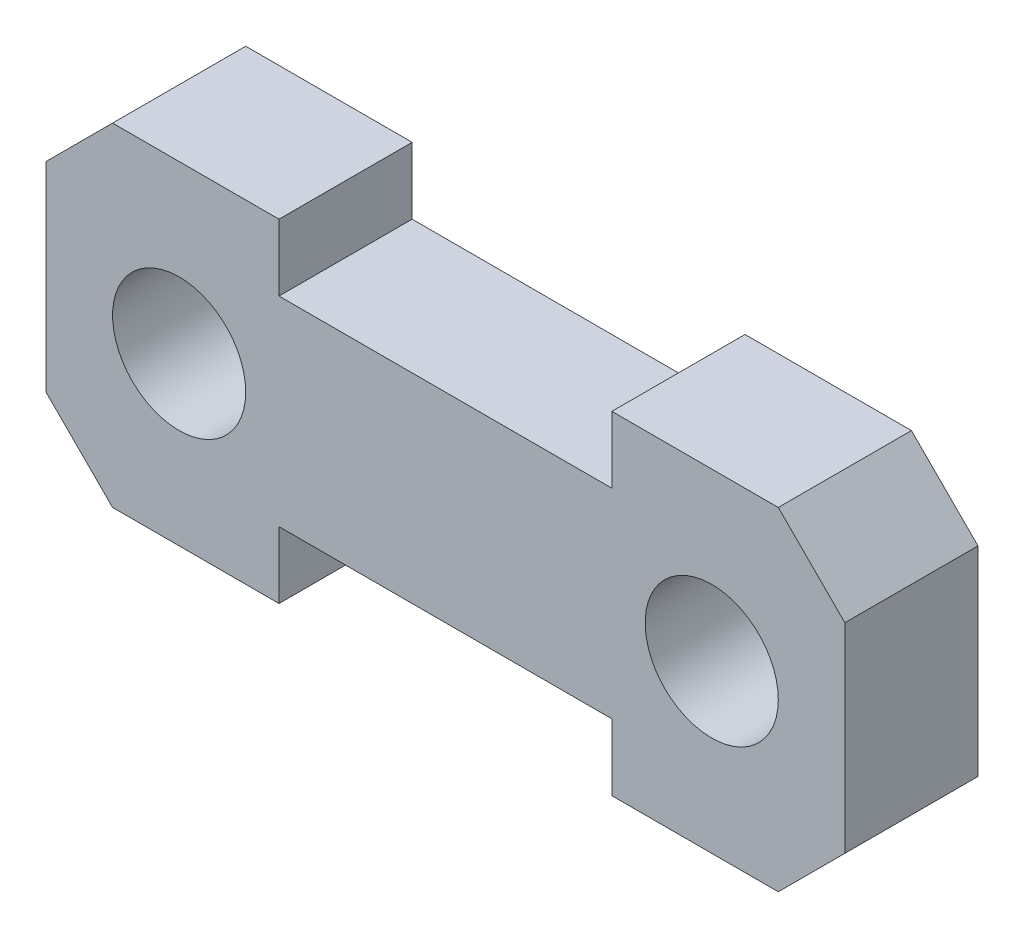
ISO-10303-21;
HEADER;
FILE_DESCRIPTION(('STEP AP214'),'2;1');
FILE_NAME('part.step','',(''),(''),'','','');
FILE_SCHEMA(('AUTOMOTIVE_DESIGN { 1 0 10303 214 1 1 1 1 }'));
ENDSEC;
DATA;
#1=APPLICATION_CONTEXT('core data for automotive mechanical design processes');
#2=APPLICATION_PROTOCOL_DEFINITION('international standard','automotive_design',2000,#1);
#3=PRODUCT_CONTEXT('',#1,'mechanical');
#4=PRODUCT('Part','Part','',(#3));
#5=PRODUCT_RELATED_PRODUCT_CATEGORY('part','',(#4));
#6=PRODUCT_DEFINITION_FORMATION('','',#4);
#7=PRODUCT_DEFINITION_CONTEXT('part definition',#1,'design');
#8=PRODUCT_DEFINITION('design','',#6,#7);
#9=PRODUCT_DEFINITION_SHAPE('','',#8);
#10=(LENGTH_UNIT() NAMED_UNIT(*) SI_UNIT(.MILLI.,.METRE.));
#11=(NAMED_UNIT(*) PLANE_ANGLE_UNIT() SI_UNIT($,.RADIAN.));
#12=(NAMED_UNIT(*) SI_UNIT($,.STERADIAN.) SOLID_ANGLE_UNIT());
#13=UNCERTAINTY_MEASURE_WITH_UNIT(LENGTH_MEASURE(1.E-05),#10,'distance_accuracy_value','');
#14=(GEOMETRIC_REPRESENTATION_CONTEXT(3) GLOBAL_UNCERTAINTY_ASSIGNED_CONTEXT((#13)) GLOBAL_UNIT_ASSIGNED_CONTEXT((#10,
#11,#12)) REPRESENTATION_CONTEXT('',''));
#15=CARTESIAN_POINT('',(0.,0.,0.));
#16=DIRECTION('',(0.,0.,1.));
#17=DIRECTION('',(1.,0.,0.));
#18=AXIS2_PLACEMENT_3D('',#15,#16,#17);
#19=CARTESIAN_POINT('',(0.,0.,2.));
#20=DIRECTION('',(0.,0.,-1.));
#21=DIRECTION('',(-1.,0.,0.));
#22=AXIS2_PLACEMENT_3D('',#19,#20,#21);
#23=PLANE('',#22);
#24=DIRECTION('',(-1.,0.,0.));
#25=VECTOR('',#24,1.);
#26=CARTESIAN_POINT('',(-5.,2.5,2.));
#27=LINE('',#26,#25);
#28=CARTESIAN_POINT('',(-2.5,2.5,2.));
#29=VERTEX_POINT('',#28);
#30=CARTESIAN_POINT('',(-5.,2.5,2.));
#31=VERTEX_POINT('',#30);
#32=EDGE_CURVE('E211',#29,#31,#27,.T.);
#33=ORIENTED_EDGE('',*,*,#32,.T.);
#34=DIRECTION('',(-0.707106781186548,-0.707106781186548,0.));
#35=VECTOR('',#34,1.);
#36=CARTESIAN_POINT('',(-6.,1.5,2.));
#37=LINE('',#36,#35);
#38=CARTESIAN_POINT('',(-6.,1.5,2.));
#39=VERTEX_POINT('',#38);
#40=EDGE_CURVE('E119',#31,#39,#37,.T.);
#41=ORIENTED_EDGE('',*,*,#40,.T.);
#42=DIRECTION('',(0.,-1.,0.));
#43=VECTOR('',#42,1.);
#44=CARTESIAN_POINT('',(-6.,1.5,2.));
#45=LINE('',#44,#43);
#46=CARTESIAN_POINT('',(-6.,-1.5,2.));
#47=VERTEX_POINT('',#46);
#48=EDGE_CURVE('E250',#39,#47,#45,.T.);
#49=ORIENTED_EDGE('',*,*,#48,.T.);
#50=DIRECTION('',(0.707106781186548,-0.707106781186547,0.));
#51=VECTOR('',#50,1.);
#52=CARTESIAN_POINT('',(-6.,-1.5,2.));
#53=LINE('',#52,#51);
#54=CARTESIAN_POINT('',(-5.,-2.5,2.));
#55=VERTEX_POINT('',#54);
#56=EDGE_CURVE('E269',#47,#55,#53,.T.);
#57=ORIENTED_EDGE('',*,*,#56,.T.);
#58=DIRECTION('',(1.,0.,0.));
#59=VECTOR('',#58,1.);
#60=CARTESIAN_POINT('',(-5.,-2.5,2.));
#61=LINE('',#60,#59);
#62=CARTESIAN_POINT('',(-2.5,-2.5,2.));
#63=VERTEX_POINT('',#62);
#64=EDGE_CURVE('E266',#55,#63,#61,.T.);
#65=ORIENTED_EDGE('',*,*,#64,.T.);
#66=DIRECTION('',(0.,1.,0.));
#67=VECTOR('',#66,1.);
#68=CARTESIAN_POINT('',(-2.5,-2.5,2.));
#69=LINE('',#68,#67);
#70=CARTESIAN_POINT('',(-2.5,-1.5,2.));
#71=VERTEX_POINT('',#70);
#72=EDGE_CURVE('E268',#63,#71,#69,.T.);
#73=ORIENTED_EDGE('',*,*,#72,.T.);
#74=DIRECTION('',(1.,0.,0.));
#75=VECTOR('',#74,1.);
#76=CARTESIAN_POINT('',(-2.5,-1.5,2.));
#77=LINE('',#76,#75);
#78=CARTESIAN_POINT('',(2.5,-1.5,2.));
#79=VERTEX_POINT('',#78);
#80=EDGE_CURVE('E271',#71,#79,#77,.T.);
#81=ORIENTED_EDGE('',*,*,#80,.T.);
#82=DIRECTION('',(0.,-1.,0.));
#83=VECTOR('',#82,1.);
#84=CARTESIAN_POINT('',(2.5,-2.5,2.));
#85=LINE('',#84,#83);
#86=CARTESIAN_POINT('',(2.5,-2.5,2.));
#87=VERTEX_POINT('',#86);
#88=EDGE_CURVE('E277',#79,#87,#85,.T.);
#89=ORIENTED_EDGE('',*,*,#88,.T.);
#90=DIRECTION('',(1.,0.,0.));
#91=VECTOR('',#90,1.);
#92=CARTESIAN_POINT('',(2.5,-2.5,2.));
#93=LINE('',#92,#91);
#94=CARTESIAN_POINT('',(5.,-2.5,2.));
#95=VERTEX_POINT('',#94);
#96=EDGE_CURVE('E279',#87,#95,#93,.T.);
#97=ORIENTED_EDGE('',*,*,#96,.T.);
#98=DIRECTION('',(0.707106781186548,0.707106781186547,0.));
#99=VECTOR('',#98,1.);
#100=CARTESIAN_POINT('',(5.,-2.5,2.));
#101=LINE('',#100,#99);
#102=CARTESIAN_POINT('',(6.,-1.5,2.));
#103=VERTEX_POINT('',#102);
#104=EDGE_CURVE('E281',#95,#103,#101,.T.);
#105=ORIENTED_EDGE('',*,*,#104,.T.);
#106=DIRECTION('',(0.,1.,0.));
#107=VECTOR('',#106,1.);
#108=CARTESIAN_POINT('',(6.,1.5,2.));
#109=LINE('',#108,#107);
#110=CARTESIAN_POINT('',(6.,1.5,2.));
#111=VERTEX_POINT('',#110);
#112=EDGE_CURVE('E283',#103,#111,#109,.T.);
#113=ORIENTED_EDGE('',*,*,#112,.T.);
#114=DIRECTION('',(-0.707106781186548,0.707106781186548,0.));
#115=VECTOR('',#114,1.);
#116=CARTESIAN_POINT('',(5.,2.5,2.));
#117=LINE('',#116,#115);
#118=CARTESIAN_POINT('',(5.,2.5,2.));
#119=VERTEX_POINT('',#118);
#120=EDGE_CURVE('E285',#111,#119,#117,.T.);
#121=ORIENTED_EDGE('',*,*,#120,.T.);
#122=DIRECTION('',(-1.,0.,0.));
#123=VECTOR('',#122,1.);
#124=CARTESIAN_POINT('',(2.5,2.5,2.));
#125=LINE('',#124,#123);
#126=CARTESIAN_POINT('',(2.5,2.5,2.));
#127=VERTEX_POINT('',#126);
#128=EDGE_CURVE('E162',#119,#127,#125,.T.);
#129=ORIENTED_EDGE('',*,*,#128,.T.);
#130=DIRECTION('',(0.,-1.,0.));
#131=VECTOR('',#130,1.);
#132=CARTESIAN_POINT('',(2.5,2.5,2.));
#133=LINE('',#132,#131);
#134=CARTESIAN_POINT('',(2.5,1.5,2.));
#135=VERTEX_POINT('',#134);
#136=EDGE_CURVE('E156',#127,#135,#133,.T.);
#137=ORIENTED_EDGE('',*,*,#136,.T.);
#138=DIRECTION('',(-1.,0.,0.));
#139=VECTOR('',#138,1.);
#140=CARTESIAN_POINT('',(-2.5,1.5,2.));
#141=LINE('',#140,#139);
#142=CARTESIAN_POINT('',(-2.5,1.5,2.));
#143=VERTEX_POINT('',#142);
#144=EDGE_CURVE('E160',#135,#143,#141,.T.);
#145=ORIENTED_EDGE('',*,*,#144,.T.);
#146=DIRECTION('',(0.,1.,0.));
#147=VECTOR('',#146,1.);
#148=CARTESIAN_POINT('',(-2.5,2.5,2.));
#149=LINE('',#148,#147);
#150=EDGE_CURVE('E52',#143,#29,#149,.T.);
#151=ORIENTED_EDGE('',*,*,#150,.T.);
#152=EDGE_LOOP('',(#33,#41,#49,#57,#65,#73,#81,#89,#97,#105,#113,#121,#129,#137,#145,#151));
#153=FACE_BOUND('',#152,.T.);
#154=CARTESIAN_POINT('',(-4.,0.,2.));
#155=DIRECTION('',(0.,0.,1.));
#156=DIRECTION('',(1.,0.,0.));
#157=AXIS2_PLACEMENT_3D('',#154,#155,#156);
#158=CIRCLE('',#157,1.);
#159=CARTESIAN_POINT('',(-3.,0.,2.));
#160=VERTEX_POINT('',#159);
#161=EDGE_CURVE('E184',#160,#160,#158,.T.);
#162=ORIENTED_EDGE('',*,*,#161,.F.);
#163=EDGE_LOOP('',(#162));
#164=FACE_BOUND('',#163,.T.);
#165=CARTESIAN_POINT('',(4.,0.,2.));
#166=DIRECTION('',(0.,0.,1.));
#167=DIRECTION('',(1.,0.,0.));
#168=AXIS2_PLACEMENT_3D('',#165,#166,#167);
#169=CIRCLE('',#168,1.);
#170=CARTESIAN_POINT('',(5.,0.,2.));
#171=VERTEX_POINT('',#170);
#172=EDGE_CURVE('E326',#171,#171,#169,.T.);
#173=ORIENTED_EDGE('',*,*,#172,.F.);
#174=EDGE_LOOP('',(#173));
#175=FACE_BOUND('',#174,.T.);
#176=ADVANCED_FACE('F35',(#153,#164,#175),#23,.F.);
#177=CARTESIAN_POINT('',(0.,0.,0.));
#178=DIRECTION('',(0.,0.,-1.));
#179=DIRECTION('',(-1.,0.,0.));
#180=AXIS2_PLACEMENT_3D('',#177,#178,#179);
#181=PLANE('',#180);
#182=CARTESIAN_POINT('',(-4.,0.,0.));
#183=DIRECTION('',(0.,0.,1.));
#184=DIRECTION('',(1.,0.,0.));
#185=AXIS2_PLACEMENT_3D('',#182,#183,#184);
#186=CIRCLE('',#185,1.);
#187=CARTESIAN_POINT('',(-3.,0.,0.));
#188=VERTEX_POINT('',#187);
#189=EDGE_CURVE('E331',#188,#188,#186,.T.);
#190=ORIENTED_EDGE('',*,*,#189,.T.);
#191=EDGE_LOOP('',(#190));
#192=FACE_BOUND('',#191,.T.);
#193=DIRECTION('',(-1.,0.,0.));
#194=VECTOR('',#193,1.);
#195=CARTESIAN_POINT('',(-5.,2.5,0.));
#196=LINE('',#195,#194);
#197=CARTESIAN_POINT('',(-2.5,2.5,0.));
#198=VERTEX_POINT('',#197);
#199=CARTESIAN_POINT('',(-5.,2.5,0.));
#200=VERTEX_POINT('',#199);
#201=EDGE_CURVE('E180',#198,#200,#196,.T.);
#202=ORIENTED_EDGE('',*,*,#201,.F.);
#203=DIRECTION('',(0.,1.,0.));
#204=VECTOR('',#203,1.);
#205=CARTESIAN_POINT('',(-2.5,2.5,0.));
#206=LINE('',#205,#204);
#207=CARTESIAN_POINT('',(-2.5,1.5,0.));
#208=VERTEX_POINT('',#207);
#209=EDGE_CURVE('E111',#208,#198,#206,.T.);
#210=ORIENTED_EDGE('',*,*,#209,.F.);
#211=DIRECTION('',(-1.,0.,0.));
#212=VECTOR('',#211,1.);
#213=CARTESIAN_POINT('',(-2.5,1.5,0.));
#214=LINE('',#213,#212);
#215=CARTESIAN_POINT('',(2.5,1.5,0.));
#216=VERTEX_POINT('',#215);
#217=EDGE_CURVE('E105',#216,#208,#214,.T.);
#218=ORIENTED_EDGE('',*,*,#217,.F.);
#219=DIRECTION('',(0.,-1.,0.));
#220=VECTOR('',#219,1.);
#221=CARTESIAN_POINT('',(2.5,2.5,0.));
#222=LINE('',#221,#220);
#223=CARTESIAN_POINT('',(2.5,2.5,0.));
#224=VERTEX_POINT('',#223);
#225=EDGE_CURVE('E170',#224,#216,#222,.T.);
#226=ORIENTED_EDGE('',*,*,#225,.F.);
#227=DIRECTION('',(-1.,0.,0.));
#228=VECTOR('',#227,1.);
#229=CARTESIAN_POINT('',(2.5,2.5,0.));
#230=LINE('',#229,#228);
#231=CARTESIAN_POINT('',(5.,2.5,0.));
#232=VERTEX_POINT('',#231);
#233=EDGE_CURVE('E206',#232,#224,#230,.T.);
#234=ORIENTED_EDGE('',*,*,#233,.F.);
#235=DIRECTION('',(-0.707106781186548,0.707106781186548,0.));
#236=VECTOR('',#235,1.);
#237=CARTESIAN_POINT('',(5.,2.5,0.));
#238=LINE('',#237,#236);
#239=CARTESIAN_POINT('',(6.,1.5,0.));
#240=VERTEX_POINT('',#239);
#241=EDGE_CURVE('E204',#240,#232,#238,.T.);
#242=ORIENTED_EDGE('',*,*,#241,.F.);
#243=DIRECTION('',(0.,1.,0.));
#244=VECTOR('',#243,1.);
#245=CARTESIAN_POINT('',(6.,1.5,0.));
#246=LINE('',#245,#244);
#247=CARTESIAN_POINT('',(6.,-1.5,0.));
#248=VERTEX_POINT('',#247);
#249=EDGE_CURVE('E202',#248,#240,#246,.T.);
#250=ORIENTED_EDGE('',*,*,#249,.F.);
#251=DIRECTION('',(0.707106781186548,0.707106781186547,0.));
#252=VECTOR('',#251,1.);
#253=CARTESIAN_POINT('',(5.,-2.5,0.));
#254=LINE('',#253,#252);
#255=CARTESIAN_POINT('',(5.,-2.5,0.));
#256=VERTEX_POINT('',#255);
#257=EDGE_CURVE('E200',#256,#248,#254,.T.);
#258=ORIENTED_EDGE('',*,*,#257,.F.);
#259=DIRECTION('',(1.,0.,0.));
#260=VECTOR('',#259,1.);
#261=CARTESIAN_POINT('',(2.5,-2.5,0.));
#262=LINE('',#261,#260);
#263=CARTESIAN_POINT('',(2.5,-2.5,0.));
#264=VERTEX_POINT('',#263);
#265=EDGE_CURVE('E198',#264,#256,#262,.T.);
#266=ORIENTED_EDGE('',*,*,#265,.F.);
#267=DIRECTION('',(0.,-1.,0.));
#268=VECTOR('',#267,1.);
#269=CARTESIAN_POINT('',(2.5,-2.5,0.));
#270=LINE('',#269,#268);
#271=CARTESIAN_POINT('',(2.5,-1.5,0.));
#272=VERTEX_POINT('',#271);
#273=EDGE_CURVE('E196',#272,#264,#270,.T.);
#274=ORIENTED_EDGE('',*,*,#273,.F.);
#275=DIRECTION('',(1.,0.,0.));
#276=VECTOR('',#275,1.);
#277=CARTESIAN_POINT('',(-2.5,-1.5,0.));
#278=LINE('',#277,#276);
#279=CARTESIAN_POINT('',(-2.5,-1.5,0.));
#280=VERTEX_POINT('',#279);
#281=EDGE_CURVE('E194',#280,#272,#278,.T.);
#282=ORIENTED_EDGE('',*,*,#281,.F.);
#283=DIRECTION('',(0.,1.,0.));
#284=VECTOR('',#283,1.);
#285=CARTESIAN_POINT('',(-2.5,-2.5,0.));
#286=LINE('',#285,#284);
#287=CARTESIAN_POINT('',(-2.5,-2.5,0.));
#288=VERTEX_POINT('',#287);
#289=EDGE_CURVE('E192',#288,#280,#286,.T.);
#290=ORIENTED_EDGE('',*,*,#289,.F.);
#291=DIRECTION('',(1.,0.,0.));
#292=VECTOR('',#291,1.);
#293=CARTESIAN_POINT('',(-5.,-2.5,0.));
#294=LINE('',#293,#292);
#295=CARTESIAN_POINT('',(-5.,-2.5,0.));
#296=VERTEX_POINT('',#295);
#297=EDGE_CURVE('E190',#296,#288,#294,.T.);
#298=ORIENTED_EDGE('',*,*,#297,.F.);
#299=DIRECTION('',(0.707106781186548,-0.707106781186547,0.));
#300=VECTOR('',#299,1.);
#301=CARTESIAN_POINT('',(-6.,-1.5,0.));
#302=LINE('',#301,#300);
#303=CARTESIAN_POINT('',(-6.,-1.5,0.));
#304=VERTEX_POINT('',#303);
#305=EDGE_CURVE('E188',#304,#296,#302,.T.);
#306=ORIENTED_EDGE('',*,*,#305,.F.);
#307=DIRECTION('',(0.,-1.,0.));
#308=VECTOR('',#307,1.);
#309=CARTESIAN_POINT('',(-6.,1.5,0.));
#310=LINE('',#309,#308);
#311=CARTESIAN_POINT('',(-6.,1.5,0.));
#312=VERTEX_POINT('',#311);
#313=EDGE_CURVE('E186',#312,#304,#310,.T.);
#314=ORIENTED_EDGE('',*,*,#313,.F.);
#315=DIRECTION('',(-0.707106781186548,-0.707106781186548,0.));
#316=VECTOR('',#315,1.);
#317=CARTESIAN_POINT('',(-6.,1.5,0.));
#318=LINE('',#317,#316);
#319=EDGE_CURVE('E183',#200,#312,#318,.T.);
#320=ORIENTED_EDGE('',*,*,#319,.F.);
#321=EDGE_LOOP('',(#202,#210,#218,#226,#234,#242,#250,#258,#266,#274,#282,#290,#298,#306,#314,#320));
#322=FACE_BOUND('',#321,.T.);
#323=CARTESIAN_POINT('',(4.,0.,0.));
#324=DIRECTION('',(0.,0.,1.));
#325=DIRECTION('',(1.,0.,0.));
#326=AXIS2_PLACEMENT_3D('',#323,#324,#325);
#327=CIRCLE('',#326,1.);
#328=CARTESIAN_POINT('',(5.,0.,0.));
#329=VERTEX_POINT('',#328);
#330=EDGE_CURVE('E329',#329,#329,#327,.T.);
#331=ORIENTED_EDGE('',*,*,#330,.T.);
#332=EDGE_LOOP('',(#331));
#333=FACE_BOUND('',#332,.T.);
#334=ADVANCED_FACE('F254',(#192,#322,#333),#181,.T.);
#335=CARTESIAN_POINT('',(-5.,2.5,2.));
#336=DIRECTION('',(0.,-1.,0.));
#337=DIRECTION('',(0.,0.,-1.));
#338=AXIS2_PLACEMENT_3D('',#335,#336,#337);
#339=PLANE('',#338);
#340=ORIENTED_EDGE('',*,*,#201,.T.);
#341=DIRECTION('',(0.,0.,-1.));
#342=VECTOR('',#341,1.);
#343=CARTESIAN_POINT('',(-5.,2.5,2.));
#344=LINE('',#343,#342);
#345=EDGE_CURVE('E11',#31,#200,#344,.T.);
#346=ORIENTED_EDGE('',*,*,#345,.F.);
#347=ORIENTED_EDGE('',*,*,#32,.F.);
#348=DIRECTION('',(0.,0.,-1.));
#349=VECTOR('',#348,1.);
#350=CARTESIAN_POINT('',(-2.5,2.5,2.));
#351=LINE('',#350,#349);
#352=EDGE_CURVE('E176',#29,#198,#351,.T.);
#353=ORIENTED_EDGE('',*,*,#352,.T.);
#354=EDGE_LOOP('',(#340,#346,#347,#353));
#355=FACE_BOUND('',#354,.T.);
#356=ADVANCED_FACE('F37',(#355),#339,.F.);
#357=CARTESIAN_POINT('',(-6.,1.5,2.));
#358=DIRECTION('',(0.707106781186547,-0.707106781186547,0.));
#359=DIRECTION('',(0.707106781186548,0.707106781186548,0.));
#360=AXIS2_PLACEMENT_3D('',#357,#358,#359);
#361=PLANE('',#360);
#362=ORIENTED_EDGE('',*,*,#319,.T.);
#363=DIRECTION('',(0.,0.,-1.));
#364=VECTOR('',#363,1.);
#365=CARTESIAN_POINT('',(-6.,1.5,2.));
#366=LINE('',#365,#364);
#367=EDGE_CURVE('E44',#39,#312,#366,.T.);
#368=ORIENTED_EDGE('',*,*,#367,.F.);
#369=ORIENTED_EDGE('',*,*,#40,.F.);
#370=ORIENTED_EDGE('',*,*,#345,.T.);
#371=EDGE_LOOP('',(#362,#368,#369,#370));
#372=FACE_BOUND('',#371,.T.);
#373=ADVANCED_FACE('F466',(#372),#361,.F.);
#374=CARTESIAN_POINT('',(-6.,1.5,2.));
#375=DIRECTION('',(1.,0.,0.));
#376=DIRECTION('',(0.,0.,-1.));
#377=AXIS2_PLACEMENT_3D('',#374,#375,#376);
#378=PLANE('',#377);
#379=ORIENTED_EDGE('',*,*,#313,.T.);
#380=DIRECTION('',(0.,0.,-1.));
#381=VECTOR('',#380,1.);
#382=CARTESIAN_POINT('',(-6.,-1.5,2.));
#383=LINE('',#382,#381);
#384=EDGE_CURVE('E242',#47,#304,#383,.T.);
#385=ORIENTED_EDGE('',*,*,#384,.F.);
#386=ORIENTED_EDGE('',*,*,#48,.F.);
#387=ORIENTED_EDGE('',*,*,#367,.T.);
#388=EDGE_LOOP('',(#379,#385,#386,#387));
#389=FACE_BOUND('',#388,.T.);
#390=ADVANCED_FACE('F248',(#389),#378,.F.);
#391=CARTESIAN_POINT('',(-6.,-1.5,2.));
#392=DIRECTION('',(0.707106781186547,0.707106781186548,0.));
#393=DIRECTION('',(-0.707106781186548,0.707106781186547,0.));
#394=AXIS2_PLACEMENT_3D('',#391,#392,#393);
#395=PLANE('',#394);
#396=ORIENTED_EDGE('',*,*,#305,.T.);
#397=DIRECTION('',(0.,0.,-1.));
#398=VECTOR('',#397,1.);
#399=CARTESIAN_POINT('',(-5.,-2.5,2.));
#400=LINE('',#399,#398);
#401=EDGE_CURVE('E239',#55,#296,#400,.T.);
#402=ORIENTED_EDGE('',*,*,#401,.F.);
#403=ORIENTED_EDGE('',*,*,#56,.F.);
#404=ORIENTED_EDGE('',*,*,#384,.T.);
#405=EDGE_LOOP('',(#396,#402,#403,#404));
#406=FACE_BOUND('',#405,.T.);
#407=ADVANCED_FACE('F260',(#406),#395,.F.);
#408=CARTESIAN_POINT('',(-5.,-2.5,2.));
#409=DIRECTION('',(0.,1.,0.));
#410=DIRECTION('',(-1.,0.,0.));
#411=AXIS2_PLACEMENT_3D('',#408,#409,#410);
#412=PLANE('',#411);
#413=ORIENTED_EDGE('',*,*,#297,.T.);
#414=DIRECTION('',(0.,0.,-1.));
#415=VECTOR('',#414,1.);
#416=CARTESIAN_POINT('',(-2.5,-2.5,2.));
#417=LINE('',#416,#415);
#418=EDGE_CURVE('E236',#63,#288,#417,.T.);
#419=ORIENTED_EDGE('',*,*,#418,.F.);
#420=ORIENTED_EDGE('',*,*,#64,.F.);
#421=ORIENTED_EDGE('',*,*,#401,.T.);
#422=EDGE_LOOP('',(#413,#419,#420,#421));
#423=FACE_BOUND('',#422,.T.);
#424=ADVANCED_FACE('F264',(#423),#412,.F.);
#425=CARTESIAN_POINT('',(-2.5,-2.5,2.));
#426=DIRECTION('',(-1.,0.,0.));
#427=DIRECTION('',(0.,0.,1.));
#428=AXIS2_PLACEMENT_3D('',#425,#426,#427);
#429=PLANE('',#428);
#430=ORIENTED_EDGE('',*,*,#289,.T.);
#431=DIRECTION('',(0.,0.,-1.));
#432=VECTOR('',#431,1.);
#433=CARTESIAN_POINT('',(-2.5,-1.5,2.));
#434=LINE('',#433,#432);
#435=EDGE_CURVE('E233',#71,#280,#434,.T.);
#436=ORIENTED_EDGE('',*,*,#435,.F.);
#437=ORIENTED_EDGE('',*,*,#72,.F.);
#438=ORIENTED_EDGE('',*,*,#418,.T.);
#439=EDGE_LOOP('',(#430,#436,#437,#438));
#440=FACE_BOUND('',#439,.T.);
#441=ADVANCED_FACE('F431',(#440),#429,.F.);
#442=CARTESIAN_POINT('',(-2.5,-1.5,2.));
#443=DIRECTION('',(0.,1.,0.));
#444=DIRECTION('',(0.,0.,1.));
#445=AXIS2_PLACEMENT_3D('',#442,#443,#444);
#446=PLANE('',#445);
#447=ORIENTED_EDGE('',*,*,#281,.T.);
#448=DIRECTION('',(0.,0.,-1.));
#449=VECTOR('',#448,1.);
#450=CARTESIAN_POINT('',(2.5,-1.5,2.));
#451=LINE('',#450,#449);
#452=EDGE_CURVE('E230',#79,#272,#451,.T.);
#453=ORIENTED_EDGE('',*,*,#452,.F.);
#454=ORIENTED_EDGE('',*,*,#80,.F.);
#455=ORIENTED_EDGE('',*,*,#435,.T.);
#456=EDGE_LOOP('',(#447,#453,#454,#455));
#457=FACE_BOUND('',#456,.T.);
#458=ADVANCED_FACE('F421',(#457),#446,.F.);
#459=CARTESIAN_POINT('',(2.5,-2.5,2.));
#460=DIRECTION('',(1.,0.,0.));
#461=DIRECTION('',(0.,0.,-1.));
#462=AXIS2_PLACEMENT_3D('',#459,#460,#461);
#463=PLANE('',#462);
#464=ORIENTED_EDGE('',*,*,#273,.T.);
#465=DIRECTION('',(0.,0.,-1.));
#466=VECTOR('',#465,1.);
#467=CARTESIAN_POINT('',(2.5,-2.5,2.));
#468=LINE('',#467,#466);
#469=EDGE_CURVE('E227',#87,#264,#468,.T.);
#470=ORIENTED_EDGE('',*,*,#469,.F.);
#471=ORIENTED_EDGE('',*,*,#88,.F.);
#472=ORIENTED_EDGE('',*,*,#452,.T.);
#473=EDGE_LOOP('',(#464,#470,#471,#472));
#474=FACE_BOUND('',#473,.T.);
#475=ADVANCED_FACE('F411',(#474),#463,.F.);
#476=CARTESIAN_POINT('',(2.5,-2.5,2.));
#477=DIRECTION('',(0.,1.,0.));
#478=DIRECTION('',(-1.,0.,0.));
#479=AXIS2_PLACEMENT_3D('',#476,#477,#478);
#480=PLANE('',#479);
#481=ORIENTED_EDGE('',*,*,#265,.T.);
#482=DIRECTION('',(0.,0.,-1.));
#483=VECTOR('',#482,1.);
#484=CARTESIAN_POINT('',(5.,-2.5,2.));
#485=LINE('',#484,#483);
#486=EDGE_CURVE('E224',#95,#256,#485,.T.);
#487=ORIENTED_EDGE('',*,*,#486,.F.);
#488=ORIENTED_EDGE('',*,*,#96,.F.);
#489=ORIENTED_EDGE('',*,*,#469,.T.);
#490=EDGE_LOOP('',(#481,#487,#488,#489));
#491=FACE_BOUND('',#490,.T.);
#492=ADVANCED_FACE('F401',(#491),#480,.F.);
#493=CARTESIAN_POINT('',(5.,-2.5,2.));
#494=DIRECTION('',(-0.707106781186547,0.707106781186548,0.));
#495=DIRECTION('',(-0.707106781186548,-0.707106781186547,0.));
#496=AXIS2_PLACEMENT_3D('',#493,#494,#495);
#497=PLANE('',#496);
#498=ORIENTED_EDGE('',*,*,#257,.T.);
#499=DIRECTION('',(0.,0.,-1.));
#500=VECTOR('',#499,1.);
#501=CARTESIAN_POINT('',(6.,-1.5,2.));
#502=LINE('',#501,#500);
#503=EDGE_CURVE('E221',#103,#248,#502,.T.);
#504=ORIENTED_EDGE('',*,*,#503,.F.);
#505=ORIENTED_EDGE('',*,*,#104,.F.);
#506=ORIENTED_EDGE('',*,*,#486,.T.);
#507=EDGE_LOOP('',(#498,#504,#505,#506));
#508=FACE_BOUND('',#507,.T.);
#509=ADVANCED_FACE('F391',(#508),#497,.F.);
#510=CARTESIAN_POINT('',(6.,1.5,2.));
#511=DIRECTION('',(-1.,0.,0.));
#512=DIRECTION('',(0.,0.,1.));
#513=AXIS2_PLACEMENT_3D('',#510,#511,#512);
#514=PLANE('',#513);
#515=ORIENTED_EDGE('',*,*,#249,.T.);
#516=DIRECTION('',(0.,0.,-1.));
#517=VECTOR('',#516,1.);
#518=CARTESIAN_POINT('',(6.,1.5,2.));
#519=LINE('',#518,#517);
#520=EDGE_CURVE('E218',#111,#240,#519,.T.);
#521=ORIENTED_EDGE('',*,*,#520,.F.);
#522=ORIENTED_EDGE('',*,*,#112,.F.);
#523=ORIENTED_EDGE('',*,*,#503,.T.);
#524=EDGE_LOOP('',(#515,#521,#522,#523));
#525=FACE_BOUND('',#524,.T.);
#526=ADVANCED_FACE('F382',(#525),#514,.F.);
#527=CARTESIAN_POINT('',(5.,2.5,2.));
#528=DIRECTION('',(-0.707106781186547,-0.707106781186547,0.));
#529=DIRECTION('',(0.707106781186548,-0.707106781186548,0.));
#530=AXIS2_PLACEMENT_3D('',#527,#528,#529);
#531=PLANE('',#530);
#532=ORIENTED_EDGE('',*,*,#241,.T.);
#533=DIRECTION('',(0.,0.,-1.));
#534=VECTOR('',#533,1.);
#535=CARTESIAN_POINT('',(5.,2.5,2.));
#536=LINE('',#535,#534);
#537=EDGE_CURVE('E215',#119,#232,#536,.T.);
#538=ORIENTED_EDGE('',*,*,#537,.F.);
#539=ORIENTED_EDGE('',*,*,#120,.F.);
#540=ORIENTED_EDGE('',*,*,#520,.T.);
#541=EDGE_LOOP('',(#532,#538,#539,#540));
#542=FACE_BOUND('',#541,.T.);
#543=ADVANCED_FACE('F291',(#542),#531,.F.);
#544=CARTESIAN_POINT('',(2.5,2.5,2.));
#545=DIRECTION('',(0.,-1.,0.));
#546=DIRECTION('',(0.,0.,-1.));
#547=AXIS2_PLACEMENT_3D('',#544,#545,#546);
#548=PLANE('',#547);
#549=ORIENTED_EDGE('',*,*,#233,.T.);
#550=DIRECTION('',(0.,0.,-1.));
#551=VECTOR('',#550,1.);
#552=CARTESIAN_POINT('',(2.5,2.5,2.));
#553=LINE('',#552,#551);
#554=EDGE_CURVE('E171',#127,#224,#553,.T.);
#555=ORIENTED_EDGE('',*,*,#554,.F.);
#556=ORIENTED_EDGE('',*,*,#128,.F.);
#557=ORIENTED_EDGE('',*,*,#537,.T.);
#558=EDGE_LOOP('',(#549,#555,#556,#557));
#559=FACE_BOUND('',#558,.T.);
#560=ADVANCED_FACE('F295',(#559),#548,.F.);
#561=CARTESIAN_POINT('',(2.5,2.5,2.));
#562=DIRECTION('',(1.,0.,0.));
#563=DIRECTION('',(0.,0.,-1.));
#564=AXIS2_PLACEMENT_3D('',#561,#562,#563);
#565=PLANE('',#564);
#566=ORIENTED_EDGE('',*,*,#225,.T.);
#567=DIRECTION('',(0.,0.,-1.));
#568=VECTOR('',#567,1.);
#569=CARTESIAN_POINT('',(2.5,1.5,2.));
#570=LINE('',#569,#568);
#571=EDGE_CURVE('E167',#135,#216,#570,.T.);
#572=ORIENTED_EDGE('',*,*,#571,.F.);
#573=ORIENTED_EDGE('',*,*,#136,.F.);
#574=ORIENTED_EDGE('',*,*,#554,.T.);
#575=EDGE_LOOP('',(#566,#572,#573,#574));
#576=FACE_BOUND('',#575,.T.);
#577=ADVANCED_FACE('F168',(#576),#565,.F.);
#578=CARTESIAN_POINT('',(-2.5,1.5,2.));
#579=DIRECTION('',(0.,-1.,0.));
#580=DIRECTION('',(0.,0.,-1.));
#581=AXIS2_PLACEMENT_3D('',#578,#579,#580);
#582=PLANE('',#581);
#583=ORIENTED_EDGE('',*,*,#217,.T.);
#584=DIRECTION('',(0.,0.,-1.));
#585=VECTOR('',#584,1.);
#586=CARTESIAN_POINT('',(-2.5,1.5,2.));
#587=LINE('',#586,#585);
#588=EDGE_CURVE('E172',#143,#208,#587,.T.);
#589=ORIENTED_EDGE('',*,*,#588,.F.);
#590=ORIENTED_EDGE('',*,*,#144,.F.);
#591=ORIENTED_EDGE('',*,*,#571,.T.);
#592=EDGE_LOOP('',(#583,#589,#590,#591));
#593=FACE_BOUND('',#592,.T.);
#594=ADVANCED_FACE('F174',(#593),#582,.F.);
#595=CARTESIAN_POINT('',(-2.5,2.5,2.));
#596=DIRECTION('',(-1.,0.,0.));
#597=DIRECTION('',(0.,0.,1.));
#598=AXIS2_PLACEMENT_3D('',#595,#596,#597);
#599=PLANE('',#598);
#600=ORIENTED_EDGE('',*,*,#209,.T.);
#601=ORIENTED_EDGE('',*,*,#352,.F.);
#602=ORIENTED_EDGE('',*,*,#150,.F.);
#603=ORIENTED_EDGE('',*,*,#588,.T.);
#604=EDGE_LOOP('',(#600,#601,#602,#603));
#605=FACE_BOUND('',#604,.T.);
#606=ADVANCED_FACE('F299',(#605),#599,.F.);
#607=CARTESIAN_POINT('',(-4.,0.,2.));
#608=DIRECTION('',(0.,0.,-1.));
#609=DIRECTION('',(-1.,0.,0.));
#610=AXIS2_PLACEMENT_3D('',#607,#608,#609);
#611=CYLINDRICAL_SURFACE('',#610,1.);
#612=ORIENTED_EDGE('',*,*,#161,.T.);
#613=EDGE_LOOP('',(#612));
#614=FACE_BOUND('',#613,.T.);
#615=ORIENTED_EDGE('',*,*,#189,.F.);
#616=EDGE_LOOP('',(#615));
#617=FACE_BOUND('',#616,.T.);
#618=ADVANCED_FACE('F301',(#614,#617),#611,.F.);
#619=CARTESIAN_POINT('',(4.,0.,2.));
#620=DIRECTION('',(0.,0.,-1.));
#621=DIRECTION('',(-1.,0.,0.));
#622=AXIS2_PLACEMENT_3D('',#619,#620,#621);
#623=CYLINDRICAL_SURFACE('',#622,1.);
#624=ORIENTED_EDGE('',*,*,#172,.T.);
#625=EDGE_LOOP('',(#624));
#626=FACE_BOUND('',#625,.T.);
#627=ORIENTED_EDGE('',*,*,#330,.F.);
#628=EDGE_LOOP('',(#627));
#629=FACE_BOUND('',#628,.T.);
#630=ADVANCED_FACE('F307',(#626,#629),#623,.F.);
#631=CLOSED_SHELL('',(#176,#334,#356,#373,#390,#407,#424,#441,#458,#475,#492,#509,#526,#543,
#560,#577,#594,#606,#618,#630));
#632=MANIFOLD_SOLID_BREP('B2',#631);
#633=ADVANCED_BREP_SHAPE_REPRESENTATION('',(#18,#632),#14);
#634=SHAPE_DEFINITION_REPRESENTATION(#9,#633);
ENDSEC;
END-ISO-10303-21;
